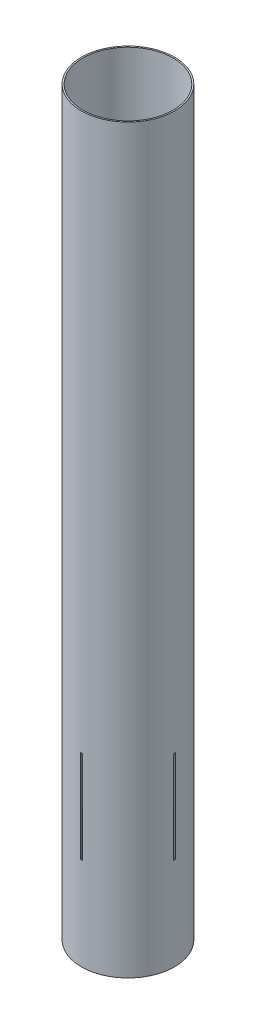
ISO-10303-21;
HEADER;
FILE_DESCRIPTION(('STEP AP214'),'2;1');
FILE_NAME('part.step','',(''),(''),'','','');
FILE_SCHEMA(('AUTOMOTIVE_DESIGN { 1 0 10303 214 1 1 1 1 }'));
ENDSEC;
DATA;
#1=APPLICATION_CONTEXT('core data for automotive mechanical design processes');
#2=APPLICATION_PROTOCOL_DEFINITION('international standard','automotive_design',2000,#1);
#3=PRODUCT_CONTEXT('',#1,'mechanical');
#4=PRODUCT('Part','Part','',(#3));
#5=PRODUCT_RELATED_PRODUCT_CATEGORY('part','',(#4));
#6=PRODUCT_DEFINITION_FORMATION('','',#4);
#7=PRODUCT_DEFINITION_CONTEXT('part definition',#1,'design');
#8=PRODUCT_DEFINITION('design','',#6,#7);
#9=PRODUCT_DEFINITION_SHAPE('','',#8);
#10=(LENGTH_UNIT() NAMED_UNIT(*) SI_UNIT(.MILLI.,.METRE.));
#11=(NAMED_UNIT(*) PLANE_ANGLE_UNIT() SI_UNIT($,.RADIAN.));
#12=(NAMED_UNIT(*) SI_UNIT($,.STERADIAN.) SOLID_ANGLE_UNIT());
#13=UNCERTAINTY_MEASURE_WITH_UNIT(LENGTH_MEASURE(1.E-05),#10,'distance_accuracy_value','');
#14=(GEOMETRIC_REPRESENTATION_CONTEXT(3) GLOBAL_UNCERTAINTY_ASSIGNED_CONTEXT((#13)) GLOBAL_UNIT_ASSIGNED_CONTEXT((#10,
#11,#12)) REPRESENTATION_CONTEXT('',''));
#15=CARTESIAN_POINT('',(0.,0.,0.));
#16=DIRECTION('',(0.,0.,1.));
#17=DIRECTION('',(1.,0.,0.));
#18=AXIS2_PLACEMENT_3D('',#15,#16,#17);
#19=CARTESIAN_POINT('',(0.,812.8,0.));
#20=DIRECTION('',(0.,-1.,0.));
#21=DIRECTION('',(0.,0.,-1.));
#22=AXIS2_PLACEMENT_3D('',#19,#20,#21);
#23=CYLINDRICAL_SURFACE('',#22,51.1048);
#24=CARTESIAN_POINT('',(0.,203.2,0.));
#25=DIRECTION('',(0.,-1.,0.));
#26=DIRECTION('',(0.,0.,-1.));
#27=AXIS2_PLACEMENT_3D('',#24,#25,#26);
#28=CIRCLE('',#27,51.1048);
#29=CARTESIAN_POINT('',(-51.0919024440625,203.2,1.14808));
#30=VERTEX_POINT('',#29);
#31=CARTESIAN_POINT('',(-51.0919024440625,203.2,-1.14808));
#32=VERTEX_POINT('',#31);
#33=EDGE_CURVE('E286',#30,#32,#28,.T.);
#34=ORIENTED_EDGE('',*,*,#33,.F.);
#35=DIRECTION('',(0.,-1.,0.));
#36=VECTOR('',#35,1.);
#37=CARTESIAN_POINT('',(-51.0919024440625,812.8,1.14808));
#38=LINE('',#37,#36);
#39=CARTESIAN_POINT('',(-51.0919024440625,101.6,1.14808));
#40=VERTEX_POINT('',#39);
#41=EDGE_CURVE('E291',#30,#40,#38,.T.);
#42=ORIENTED_EDGE('',*,*,#41,.T.);
#43=CARTESIAN_POINT('',(0.,101.6,0.));
#44=DIRECTION('',(0.,-1.,0.));
#45=DIRECTION('',(0.,0.,-1.));
#46=AXIS2_PLACEMENT_3D('',#43,#44,#45);
#47=CIRCLE('',#46,51.1048);
#48=CARTESIAN_POINT('',(-51.0919024440625,101.6,-1.14808));
#49=VERTEX_POINT('',#48);
#50=EDGE_CURVE('E283',#40,#49,#47,.T.);
#51=ORIENTED_EDGE('',*,*,#50,.T.);
#52=DIRECTION('',(0.,-1.,0.));
#53=VECTOR('',#52,1.);
#54=CARTESIAN_POINT('',(-51.0919024440625,812.8,-1.14808));
#55=LINE('',#54,#53);
#56=EDGE_CURVE('E288',#49,#32,#55,.F.);
#57=ORIENTED_EDGE('',*,*,#56,.T.);
#58=EDGE_LOOP('',(#34,#42,#51,#57));
#59=FACE_BOUND('',#58,.T.);
#60=CARTESIAN_POINT('',(0.,203.2,0.));
#61=DIRECTION('',(0.,-1.,0.));
#62=DIRECTION('',(0.,0.,-1.));
#63=AXIS2_PLACEMENT_3D('',#60,#61,#62);
#64=CIRCLE('',#63,51.1048);
#65=CARTESIAN_POINT('',(51.0919024440625,203.2,-1.14807999999999));
#66=VERTEX_POINT('',#65);
#67=CARTESIAN_POINT('',(51.0919024440625,203.2,1.14808000000001));
#68=VERTEX_POINT('',#67);
#69=EDGE_CURVE('E266',#66,#68,#64,.T.);
#70=ORIENTED_EDGE('',*,*,#69,.F.);
#71=DIRECTION('',(0.,-1.,0.));
#72=VECTOR('',#71,1.);
#73=CARTESIAN_POINT('',(51.0919024440625,812.8,-1.14807999999999));
#74=LINE('',#73,#72);
#75=CARTESIAN_POINT('',(51.0919024440625,101.6,-1.14807999999999));
#76=VERTEX_POINT('',#75);
#77=EDGE_CURVE('E269',#66,#76,#74,.T.);
#78=ORIENTED_EDGE('',*,*,#77,.T.);
#79=CARTESIAN_POINT('',(0.,101.6,0.));
#80=DIRECTION('',(0.,-1.,0.));
#81=DIRECTION('',(0.,0.,-1.));
#82=AXIS2_PLACEMENT_3D('',#79,#80,#81);
#83=CIRCLE('',#82,51.1048);
#84=CARTESIAN_POINT('',(51.0919024440625,101.6,1.14808000000001));
#85=VERTEX_POINT('',#84);
#86=EDGE_CURVE('E264',#76,#85,#83,.T.);
#87=ORIENTED_EDGE('',*,*,#86,.T.);
#88=DIRECTION('',(0.,-1.,0.));
#89=VECTOR('',#88,1.);
#90=CARTESIAN_POINT('',(51.0919024440625,812.8,1.14808000000001));
#91=LINE('',#90,#89);
#92=EDGE_CURVE('E173',#85,#68,#91,.F.);
#93=ORIENTED_EDGE('',*,*,#92,.T.);
#94=EDGE_LOOP('',(#70,#78,#87,#93));
#95=FACE_BOUND('',#94,.T.);
#96=CARTESIAN_POINT('',(0.,812.8,0.));
#97=DIRECTION('',(0.,1.,0.));
#98=DIRECTION('',(0.,0.,1.));
#99=AXIS2_PLACEMENT_3D('',#96,#97,#98);
#100=CIRCLE('',#99,51.1048);
#101=CARTESIAN_POINT('',(0.,812.8,51.1048));
#102=VERTEX_POINT('',#101);
#103=EDGE_CURVE('E166',#102,#102,#100,.T.);
#104=ORIENTED_EDGE('',*,*,#103,.F.);
#105=EDGE_LOOP('',(#104));
#106=FACE_BOUND('',#105,.T.);
#107=CARTESIAN_POINT('',(0.,0.,0.));
#108=DIRECTION('',(0.,1.,0.));
#109=DIRECTION('',(0.,0.,1.));
#110=AXIS2_PLACEMENT_3D('',#107,#108,#109);
#111=CIRCLE('',#110,51.1048);
#112=CARTESIAN_POINT('',(0.,0.,51.1048));
#113=VERTEX_POINT('',#112);
#114=EDGE_CURVE('E305',#113,#113,#111,.T.);
#115=ORIENTED_EDGE('',*,*,#114,.T.);
#116=EDGE_LOOP('',(#115));
#117=FACE_BOUND('',#116,.T.);
#118=CARTESIAN_POINT('',(0.,203.2,0.));
#119=DIRECTION('',(0.,-1.,0.));
#120=DIRECTION('',(0.,0.,-1.));
#121=AXIS2_PLACEMENT_3D('',#118,#119,#120);
#122=CIRCLE('',#121,51.1048);
#123=CARTESIAN_POINT('',(1.14807999999999,203.2,51.0919024440625));
#124=VERTEX_POINT('',#123);
#125=CARTESIAN_POINT('',(-1.14808000000001,203.2,51.0919024440625));
#126=VERTEX_POINT('',#125);
#127=EDGE_CURVE('E275',#124,#126,#122,.T.);
#128=ORIENTED_EDGE('',*,*,#127,.F.);
#129=DIRECTION('',(0.,-1.,0.));
#130=VECTOR('',#129,1.);
#131=CARTESIAN_POINT('',(1.14807999999999,812.8,51.0919024440625));
#132=LINE('',#131,#130);
#133=CARTESIAN_POINT('',(1.14807999999999,101.6,51.0919024440625));
#134=VERTEX_POINT('',#133);
#135=EDGE_CURVE('E280',#124,#134,#132,.T.);
#136=ORIENTED_EDGE('',*,*,#135,.T.);
#137=CARTESIAN_POINT('',(0.,101.6,0.));
#138=DIRECTION('',(0.,-1.,0.));
#139=DIRECTION('',(0.,0.,-1.));
#140=AXIS2_PLACEMENT_3D('',#137,#138,#139);
#141=CIRCLE('',#140,51.1048);
#142=CARTESIAN_POINT('',(-1.14808000000001,101.6,51.0919024440625));
#143=VERTEX_POINT('',#142);
#144=EDGE_CURVE('E272',#134,#143,#141,.T.);
#145=ORIENTED_EDGE('',*,*,#144,.T.);
#146=DIRECTION('',(0.,-1.,0.));
#147=VECTOR('',#146,1.);
#148=CARTESIAN_POINT('',(-1.14808000000001,812.8,51.0919024440625));
#149=LINE('',#148,#147);
#150=EDGE_CURVE('E277',#143,#126,#149,.F.);
#151=ORIENTED_EDGE('',*,*,#150,.T.);
#152=EDGE_LOOP('',(#128,#136,#145,#151));
#153=FACE_BOUND('',#152,.T.);
#154=CARTESIAN_POINT('',(0.,203.2,0.));
#155=DIRECTION('',(0.,-1.,0.));
#156=DIRECTION('',(0.,0.,-1.));
#157=AXIS2_PLACEMENT_3D('',#154,#155,#156);
#158=CIRCLE('',#157,51.1048);
#159=CARTESIAN_POINT('',(-1.14808,203.2,-51.0919024440625));
#160=VERTEX_POINT('',#159);
#161=CARTESIAN_POINT('',(1.14808,203.2,-51.0919024440625));
#162=VERTEX_POINT('',#161);
#163=EDGE_CURVE('E296',#160,#162,#158,.T.);
#164=ORIENTED_EDGE('',*,*,#163,.F.);
#165=DIRECTION('',(0.,-1.,0.));
#166=VECTOR('',#165,1.);
#167=CARTESIAN_POINT('',(-1.14808,812.8,-51.0919024440625));
#168=LINE('',#167,#166);
#169=CARTESIAN_POINT('',(-1.14808,101.6,-51.0919024440625));
#170=VERTEX_POINT('',#169);
#171=EDGE_CURVE('E299',#160,#170,#168,.T.);
#172=ORIENTED_EDGE('',*,*,#171,.T.);
#173=CARTESIAN_POINT('',(0.,101.6,0.));
#174=DIRECTION('',(0.,-1.,0.));
#175=DIRECTION('',(0.,0.,-1.));
#176=AXIS2_PLACEMENT_3D('',#173,#174,#175);
#177=CIRCLE('',#176,51.1048);
#178=CARTESIAN_POINT('',(1.14808,101.6,-51.0919024440625));
#179=VERTEX_POINT('',#178);
#180=EDGE_CURVE('E294',#170,#179,#177,.T.);
#181=ORIENTED_EDGE('',*,*,#180,.T.);
#182=DIRECTION('',(0.,-1.,0.));
#183=VECTOR('',#182,1.);
#184=CARTESIAN_POINT('',(1.14808,812.8,-51.0919024440625));
#185=LINE('',#184,#183);
#186=EDGE_CURVE('E229',#179,#162,#185,.F.);
#187=ORIENTED_EDGE('',*,*,#186,.T.);
#188=EDGE_LOOP('',(#164,#172,#181,#187));
#189=FACE_BOUND('',#188,.T.);
#190=ADVANCED_FACE('F43',(#59,#95,#106,#117,#153,#189),#23,.T.);
#191=CARTESIAN_POINT('',(0.,812.8,0.));
#192=DIRECTION('',(0.,-1.,0.));
#193=DIRECTION('',(0.,0.,-1.));
#194=AXIS2_PLACEMENT_3D('',#191,#192,#193);
#195=CYLINDRICAL_SURFACE('',#194,49.53);
#196=CARTESIAN_POINT('',(0.,812.8,0.));
#197=DIRECTION('',(0.,1.,0.));
#198=DIRECTION('',(0.,0.,1.));
#199=AXIS2_PLACEMENT_3D('',#196,#197,#198);
#200=CIRCLE('',#199,49.53);
#201=CARTESIAN_POINT('',(0.,812.8,49.53));
#202=VERTEX_POINT('',#201);
#203=EDGE_CURVE('E302',#202,#202,#200,.T.);
#204=ORIENTED_EDGE('',*,*,#203,.T.);
#205=EDGE_LOOP('',(#204));
#206=FACE_BOUND('',#205,.T.);
#207=CARTESIAN_POINT('',(0.,0.,0.));
#208=DIRECTION('',(0.,1.,0.));
#209=DIRECTION('',(0.,0.,1.));
#210=AXIS2_PLACEMENT_3D('',#207,#208,#209);
#211=CIRCLE('',#210,49.53);
#212=CARTESIAN_POINT('',(0.,0.,49.53));
#213=VERTEX_POINT('',#212);
#214=EDGE_CURVE('E301',#213,#213,#211,.T.);
#215=ORIENTED_EDGE('',*,*,#214,.F.);
#216=EDGE_LOOP('',(#215));
#217=FACE_BOUND('',#216,.T.);
#218=DIRECTION('',(0.,-1.,0.));
#219=VECTOR('',#218,1.);
#220=CARTESIAN_POINT('',(49.5166922594149,812.8,-1.14807999999999));
#221=LINE('',#220,#219);
#222=CARTESIAN_POINT('',(49.5166922594149,203.2,-1.14807999999999));
#223=VERTEX_POINT('',#222);
#224=CARTESIAN_POINT('',(49.5166922594149,101.6,-1.14807999999999));
#225=VERTEX_POINT('',#224);
#226=EDGE_CURVE('E181',#223,#225,#221,.T.);
#227=ORIENTED_EDGE('',*,*,#226,.F.);
#228=CARTESIAN_POINT('',(0.,203.2,0.));
#229=DIRECTION('',(0.,-1.,0.));
#230=DIRECTION('',(0.,0.,-1.));
#231=AXIS2_PLACEMENT_3D('',#228,#229,#230);
#232=CIRCLE('',#231,49.53);
#233=CARTESIAN_POINT('',(49.5166922594149,203.2,1.14808000000001));
#234=VERTEX_POINT('',#233);
#235=EDGE_CURVE('E180',#223,#234,#232,.T.);
#236=ORIENTED_EDGE('',*,*,#235,.T.);
#237=DIRECTION('',(0.,-1.,0.));
#238=VECTOR('',#237,1.);
#239=CARTESIAN_POINT('',(49.5166922594149,812.8,1.14808000000001));
#240=LINE('',#239,#238);
#241=CARTESIAN_POINT('',(49.5166922594149,101.6,1.14808000000001));
#242=VERTEX_POINT('',#241);
#243=EDGE_CURVE('E165',#242,#234,#240,.F.);
#244=ORIENTED_EDGE('',*,*,#243,.F.);
#245=CARTESIAN_POINT('',(0.,101.6,0.));
#246=DIRECTION('',(0.,-1.,0.));
#247=DIRECTION('',(0.,0.,-1.));
#248=AXIS2_PLACEMENT_3D('',#245,#246,#247);
#249=CIRCLE('',#248,49.53);
#250=EDGE_CURVE('E154',#225,#242,#249,.T.);
#251=ORIENTED_EDGE('',*,*,#250,.F.);
#252=EDGE_LOOP('',(#227,#236,#244,#251));
#253=FACE_BOUND('',#252,.T.);
#254=DIRECTION('',(0.,-1.,0.));
#255=VECTOR('',#254,1.);
#256=CARTESIAN_POINT('',(1.14807999999999,812.8,49.5166922594149));
#257=LINE('',#256,#255);
#258=CARTESIAN_POINT('',(1.14807999999999,203.2,49.5166922594149));
#259=VERTEX_POINT('',#258);
#260=CARTESIAN_POINT('',(1.14807999999999,101.6,49.5166922594149));
#261=VERTEX_POINT('',#260);
#262=EDGE_CURVE('E191',#259,#261,#257,.T.);
#263=ORIENTED_EDGE('',*,*,#262,.F.);
#264=CARTESIAN_POINT('',(0.,203.2,0.));
#265=DIRECTION('',(0.,-1.,0.));
#266=DIRECTION('',(0.,0.,-1.));
#267=AXIS2_PLACEMENT_3D('',#264,#265,#266);
#268=CIRCLE('',#267,49.53);
#269=CARTESIAN_POINT('',(-1.14808000000001,203.2,49.5166922594149));
#270=VERTEX_POINT('',#269);
#271=EDGE_CURVE('E194',#259,#270,#268,.T.);
#272=ORIENTED_EDGE('',*,*,#271,.T.);
#273=DIRECTION('',(0.,-1.,0.));
#274=VECTOR('',#273,1.);
#275=CARTESIAN_POINT('',(-1.14808000000001,812.8,49.5166922594149));
#276=LINE('',#275,#274);
#277=CARTESIAN_POINT('',(-1.14808000000001,101.6,49.5166922594149));
#278=VERTEX_POINT('',#277);
#279=EDGE_CURVE('E189',#278,#270,#276,.F.);
#280=ORIENTED_EDGE('',*,*,#279,.F.);
#281=CARTESIAN_POINT('',(0.,101.6,0.));
#282=DIRECTION('',(0.,-1.,0.));
#283=DIRECTION('',(0.,0.,-1.));
#284=AXIS2_PLACEMENT_3D('',#281,#282,#283);
#285=CIRCLE('',#284,49.53);
#286=EDGE_CURVE('E187',#261,#278,#285,.T.);
#287=ORIENTED_EDGE('',*,*,#286,.F.);
#288=EDGE_LOOP('',(#263,#272,#280,#287));
#289=FACE_BOUND('',#288,.T.);
#290=DIRECTION('',(0.,-1.,0.));
#291=VECTOR('',#290,1.);
#292=CARTESIAN_POINT('',(-49.5166922594149,812.8,1.14808));
#293=LINE('',#292,#291);
#294=CARTESIAN_POINT('',(-49.5166922594149,203.2,1.14808));
#295=VERTEX_POINT('',#294);
#296=CARTESIAN_POINT('',(-49.5166922594149,101.6,1.14808));
#297=VERTEX_POINT('',#296);
#298=EDGE_CURVE('E201',#295,#297,#293,.T.);
#299=ORIENTED_EDGE('',*,*,#298,.F.);
#300=CARTESIAN_POINT('',(0.,203.2,0.));
#301=DIRECTION('',(0.,-1.,0.));
#302=DIRECTION('',(0.,0.,-1.));
#303=AXIS2_PLACEMENT_3D('',#300,#301,#302);
#304=CIRCLE('',#303,49.53);
#305=CARTESIAN_POINT('',(-49.5166922594149,203.2,-1.14808));
#306=VERTEX_POINT('',#305);
#307=EDGE_CURVE('E204',#295,#306,#304,.T.);
#308=ORIENTED_EDGE('',*,*,#307,.T.);
#309=DIRECTION('',(0.,-1.,0.));
#310=VECTOR('',#309,1.);
#311=CARTESIAN_POINT('',(-49.5166922594149,812.8,-1.14808));
#312=LINE('',#311,#310);
#313=CARTESIAN_POINT('',(-49.5166922594149,101.6,-1.14808));
#314=VERTEX_POINT('',#313);
#315=EDGE_CURVE('E199',#314,#306,#312,.F.);
#316=ORIENTED_EDGE('',*,*,#315,.F.);
#317=CARTESIAN_POINT('',(0.,101.6,0.));
#318=DIRECTION('',(0.,-1.,0.));
#319=DIRECTION('',(0.,0.,-1.));
#320=AXIS2_PLACEMENT_3D('',#317,#318,#319);
#321=CIRCLE('',#320,49.53);
#322=EDGE_CURVE('E197',#297,#314,#321,.T.);
#323=ORIENTED_EDGE('',*,*,#322,.F.);
#324=EDGE_LOOP('',(#299,#308,#316,#323));
#325=FACE_BOUND('',#324,.T.);
#326=DIRECTION('',(0.,-1.,0.));
#327=VECTOR('',#326,1.);
#328=CARTESIAN_POINT('',(-1.14808,812.8,-49.5166922594149));
#329=LINE('',#328,#327);
#330=CARTESIAN_POINT('',(-1.14808,203.2,-49.5166922594149));
#331=VERTEX_POINT('',#330);
#332=CARTESIAN_POINT('',(-1.14808,101.6,-49.5166922594149));
#333=VERTEX_POINT('',#332);
#334=EDGE_CURVE('E50',#331,#333,#329,.T.);
#335=ORIENTED_EDGE('',*,*,#334,.F.);
#336=CARTESIAN_POINT('',(0.,203.2,0.));
#337=DIRECTION('',(0.,-1.,0.));
#338=DIRECTION('',(0.,0.,-1.));
#339=AXIS2_PLACEMENT_3D('',#336,#337,#338);
#340=CIRCLE('',#339,49.53);
#341=CARTESIAN_POINT('',(1.14808,203.2,-49.5166922594149));
#342=VERTEX_POINT('',#341);
#343=EDGE_CURVE('E11',#331,#342,#340,.T.);
#344=ORIENTED_EDGE('',*,*,#343,.T.);
#345=DIRECTION('',(0.,-1.,0.));
#346=VECTOR('',#345,1.);
#347=CARTESIAN_POINT('',(1.14808,812.8,-49.5166922594149));
#348=LINE('',#347,#346);
#349=CARTESIAN_POINT('',(1.14808,101.6,-49.5166922594149));
#350=VERTEX_POINT('',#349);
#351=EDGE_CURVE('E209',#350,#342,#348,.F.);
#352=ORIENTED_EDGE('',*,*,#351,.F.);
#353=CARTESIAN_POINT('',(0.,101.6,0.));
#354=DIRECTION('',(0.,-1.,0.));
#355=DIRECTION('',(0.,0.,-1.));
#356=AXIS2_PLACEMENT_3D('',#353,#354,#355);
#357=CIRCLE('',#356,49.53);
#358=EDGE_CURVE('E207',#333,#350,#357,.T.);
#359=ORIENTED_EDGE('',*,*,#358,.F.);
#360=EDGE_LOOP('',(#335,#344,#352,#359));
#361=FACE_BOUND('',#360,.T.);
#362=ADVANCED_FACE('F178',(#206,#217,#253,#289,#325,#361),#195,.F.);
#363=CARTESIAN_POINT('',(0.,812.8,0.));
#364=DIRECTION('',(0.,1.,0.));
#365=DIRECTION('',(0.,0.,1.));
#366=AXIS2_PLACEMENT_3D('',#363,#364,#365);
#367=PLANE('',#366);
#368=ORIENTED_EDGE('',*,*,#103,.T.);
#369=EDGE_LOOP('',(#368));
#370=FACE_BOUND('',#369,.T.);
#371=ORIENTED_EDGE('',*,*,#203,.F.);
#372=EDGE_LOOP('',(#371));
#373=FACE_BOUND('',#372,.T.);
#374=ADVANCED_FACE('F318',(#370,#373),#367,.T.);
#375=CARTESIAN_POINT('',(0.,0.,0.));
#376=DIRECTION('',(0.,1.,0.));
#377=DIRECTION('',(0.,0.,1.));
#378=AXIS2_PLACEMENT_3D('',#375,#376,#377);
#379=PLANE('',#378);
#380=ORIENTED_EDGE('',*,*,#114,.F.);
#381=EDGE_LOOP('',(#380));
#382=FACE_BOUND('',#381,.T.);
#383=ORIENTED_EDGE('',*,*,#214,.T.);
#384=EDGE_LOOP('',(#383));
#385=FACE_BOUND('',#384,.T.);
#386=ADVANCED_FACE('F314',(#382,#385),#379,.F.);
#387=CARTESIAN_POINT('',(51.7271570187008,203.2,-1.14807999999999));
#388=DIRECTION('',(0.,0.,-1.));
#389=DIRECTION('',(-1.,0.,0.));
#390=AXIS2_PLACEMENT_3D('',#387,#388,#389);
#391=PLANE('',#390);
#392=DIRECTION('',(1.,0.,0.));
#393=VECTOR('',#392,1.);
#394=CARTESIAN_POINT('',(51.7271570187008,203.2,-1.14807999999999));
#395=LINE('',#394,#393);
#396=EDGE_CURVE('E260',#223,#66,#395,.T.);
#397=ORIENTED_EDGE('',*,*,#396,.F.);
#398=ORIENTED_EDGE('',*,*,#226,.T.);
#399=DIRECTION('',(1.,0.,0.));
#400=VECTOR('',#399,1.);
#401=CARTESIAN_POINT('',(51.7271570187008,101.6,-1.14807999999999));
#402=LINE('',#401,#400);
#403=EDGE_CURVE('E160',#225,#76,#402,.T.);
#404=ORIENTED_EDGE('',*,*,#403,.T.);
#405=ORIENTED_EDGE('',*,*,#77,.F.);
#406=EDGE_LOOP('',(#397,#398,#404,#405));
#407=FACE_BOUND('',#406,.T.);
#408=ADVANCED_FACE('F317',(#407),#391,.F.);
#409=CARTESIAN_POINT('',(51.7271570187008,203.2,1.14808000000001));
#410=DIRECTION('',(0.,0.,1.));
#411=DIRECTION('',(1.,0.,0.));
#412=AXIS2_PLACEMENT_3D('',#409,#410,#411);
#413=PLANE('',#412);
#414=DIRECTION('',(-1.,0.,0.));
#415=VECTOR('',#414,1.);
#416=CARTESIAN_POINT('',(51.7271570187008,101.6,1.14808000000001));
#417=LINE('',#416,#415);
#418=EDGE_CURVE('E157',#85,#242,#417,.T.);
#419=ORIENTED_EDGE('',*,*,#418,.T.);
#420=ORIENTED_EDGE('',*,*,#243,.T.);
#421=DIRECTION('',(-1.,0.,0.));
#422=VECTOR('',#421,1.);
#423=CARTESIAN_POINT('',(51.7271570187008,203.2,1.14808000000001));
#424=LINE('',#423,#422);
#425=EDGE_CURVE('E258',#68,#234,#424,.T.);
#426=ORIENTED_EDGE('',*,*,#425,.F.);
#427=ORIENTED_EDGE('',*,*,#92,.F.);
#428=EDGE_LOOP('',(#419,#420,#426,#427));
#429=FACE_BOUND('',#428,.T.);
#430=ADVANCED_FACE('F169',(#429),#413,.F.);
#431=CARTESIAN_POINT('',(0.,203.2,0.));
#432=DIRECTION('',(0.,-1.,0.));
#433=DIRECTION('',(0.,0.,-1.));
#434=AXIS2_PLACEMENT_3D('',#431,#432,#433);
#435=PLANE('',#434);
#436=ORIENTED_EDGE('',*,*,#69,.T.);
#437=ORIENTED_EDGE('',*,*,#425,.T.);
#438=ORIENTED_EDGE('',*,*,#235,.F.);
#439=ORIENTED_EDGE('',*,*,#396,.T.);
#440=EDGE_LOOP('',(#436,#437,#438,#439));
#441=FACE_BOUND('',#440,.T.);
#442=ADVANCED_FACE('F333',(#441),#435,.T.);
#443=CARTESIAN_POINT('',(0.,101.6,0.));
#444=DIRECTION('',(0.,-1.,0.));
#445=DIRECTION('',(0.,0.,-1.));
#446=AXIS2_PLACEMENT_3D('',#443,#444,#445);
#447=PLANE('',#446);
#448=ORIENTED_EDGE('',*,*,#403,.F.);
#449=ORIENTED_EDGE('',*,*,#250,.T.);
#450=ORIENTED_EDGE('',*,*,#418,.F.);
#451=ORIENTED_EDGE('',*,*,#86,.F.);
#452=EDGE_LOOP('',(#448,#449,#450,#451));
#453=FACE_BOUND('',#452,.T.);
#454=ADVANCED_FACE('F156',(#453),#447,.F.);
#455=CARTESIAN_POINT('',(1.14807999999999,203.2,51.7271570187008));
#456=DIRECTION('',(1.,0.,0.));
#457=DIRECTION('',(0.,0.,-1.));
#458=AXIS2_PLACEMENT_3D('',#455,#456,#457);
#459=PLANE('',#458);
#460=DIRECTION('',(0.,0.,1.));
#461=VECTOR('',#460,1.);
#462=CARTESIAN_POINT('',(1.14807999999999,203.2,51.7271570187008));
#463=LINE('',#462,#461);
#464=EDGE_CURVE('E175',#259,#124,#463,.T.);
#465=ORIENTED_EDGE('',*,*,#464,.F.);
#466=ORIENTED_EDGE('',*,*,#262,.T.);
#467=DIRECTION('',(0.,0.,1.));
#468=VECTOR('',#467,1.);
#469=CARTESIAN_POINT('',(1.14807999999999,101.6,51.7271570187008));
#470=LINE('',#469,#468);
#471=EDGE_CURVE('E248',#261,#134,#470,.T.);
#472=ORIENTED_EDGE('',*,*,#471,.T.);
#473=ORIENTED_EDGE('',*,*,#135,.F.);
#474=EDGE_LOOP('',(#465,#466,#472,#473));
#475=FACE_BOUND('',#474,.T.);
#476=ADVANCED_FACE('F339',(#475),#459,.F.);
#477=CARTESIAN_POINT('',(-1.14808000000001,203.2,51.7271570187008));
#478=DIRECTION('',(-1.,0.,0.));
#479=DIRECTION('',(0.,0.,1.));
#480=AXIS2_PLACEMENT_3D('',#477,#478,#479);
#481=PLANE('',#480);
#482=DIRECTION('',(0.,0.,-1.));
#483=VECTOR('',#482,1.);
#484=CARTESIAN_POINT('',(-1.14808000000001,101.6,51.7271570187008));
#485=LINE('',#484,#483);
#486=EDGE_CURVE('E245',#143,#278,#485,.T.);
#487=ORIENTED_EDGE('',*,*,#486,.T.);
#488=ORIENTED_EDGE('',*,*,#279,.T.);
#489=DIRECTION('',(0.,0.,-1.));
#490=VECTOR('',#489,1.);
#491=CARTESIAN_POINT('',(-1.14808000000001,203.2,51.7271570187008));
#492=LINE('',#491,#490);
#493=EDGE_CURVE('E251',#126,#270,#492,.T.);
#494=ORIENTED_EDGE('',*,*,#493,.F.);
#495=ORIENTED_EDGE('',*,*,#150,.F.);
#496=EDGE_LOOP('',(#487,#488,#494,#495));
#497=FACE_BOUND('',#496,.T.);
#498=ADVANCED_FACE('F348',(#497),#481,.F.);
#499=CARTESIAN_POINT('',(0.,203.2,0.));
#500=DIRECTION('',(0.,-1.,0.));
#501=DIRECTION('',(0.,0.,-1.));
#502=AXIS2_PLACEMENT_3D('',#499,#500,#501);
#503=PLANE('',#502);
#504=ORIENTED_EDGE('',*,*,#127,.T.);
#505=ORIENTED_EDGE('',*,*,#493,.T.);
#506=ORIENTED_EDGE('',*,*,#271,.F.);
#507=ORIENTED_EDGE('',*,*,#464,.T.);
#508=EDGE_LOOP('',(#504,#505,#506,#507));
#509=FACE_BOUND('',#508,.T.);
#510=ADVANCED_FACE('F344',(#509),#503,.T.);
#511=CARTESIAN_POINT('',(0.,101.6,0.));
#512=DIRECTION('',(0.,-1.,0.));
#513=DIRECTION('',(0.,0.,-1.));
#514=AXIS2_PLACEMENT_3D('',#511,#512,#513);
#515=PLANE('',#514);
#516=ORIENTED_EDGE('',*,*,#471,.F.);
#517=ORIENTED_EDGE('',*,*,#286,.T.);
#518=ORIENTED_EDGE('',*,*,#486,.F.);
#519=ORIENTED_EDGE('',*,*,#144,.F.);
#520=EDGE_LOOP('',(#516,#517,#518,#519));
#521=FACE_BOUND('',#520,.T.);
#522=ADVANCED_FACE('F347',(#521),#515,.F.);
#523=CARTESIAN_POINT('',(-51.7271570187008,203.2,1.14808));
#524=DIRECTION('',(0.,0.,1.));
#525=DIRECTION('',(1.,0.,0.));
#526=AXIS2_PLACEMENT_3D('',#523,#524,#525);
#527=PLANE('',#526);
#528=DIRECTION('',(-1.,0.,0.));
#529=VECTOR('',#528,1.);
#530=CARTESIAN_POINT('',(-51.7271570187008,203.2,1.14808));
#531=LINE('',#530,#529);
#532=EDGE_CURVE('E242',#295,#30,#531,.T.);
#533=ORIENTED_EDGE('',*,*,#532,.F.);
#534=ORIENTED_EDGE('',*,*,#298,.T.);
#535=DIRECTION('',(-1.,0.,0.));
#536=VECTOR('',#535,1.);
#537=CARTESIAN_POINT('',(-51.7271570187008,101.6,1.14808));
#538=LINE('',#537,#536);
#539=EDGE_CURVE('E234',#297,#40,#538,.T.);
#540=ORIENTED_EDGE('',*,*,#539,.T.);
#541=ORIENTED_EDGE('',*,*,#41,.F.);
#542=EDGE_LOOP('',(#533,#534,#540,#541));
#543=FACE_BOUND('',#542,.T.);
#544=ADVANCED_FACE('F352',(#543),#527,.F.);
#545=CARTESIAN_POINT('',(-51.7271570187008,203.2,-1.14808));
#546=DIRECTION('',(0.,0.,-1.));
#547=DIRECTION('',(-1.,0.,0.));
#548=AXIS2_PLACEMENT_3D('',#545,#546,#547);
#549=PLANE('',#548);
#550=DIRECTION('',(1.,0.,0.));
#551=VECTOR('',#550,1.);
#552=CARTESIAN_POINT('',(-51.7271570187008,101.6,-1.14808));
#553=LINE('',#552,#551);
#554=EDGE_CURVE('E65',#49,#314,#553,.T.);
#555=ORIENTED_EDGE('',*,*,#554,.T.);
#556=ORIENTED_EDGE('',*,*,#315,.T.);
#557=DIRECTION('',(1.,0.,0.));
#558=VECTOR('',#557,1.);
#559=CARTESIAN_POINT('',(-51.7271570187008,203.2,-1.14808));
#560=LINE('',#559,#558);
#561=EDGE_CURVE('E240',#32,#306,#560,.T.);
#562=ORIENTED_EDGE('',*,*,#561,.F.);
#563=ORIENTED_EDGE('',*,*,#56,.F.);
#564=EDGE_LOOP('',(#555,#556,#562,#563));
#565=FACE_BOUND('',#564,.T.);
#566=ADVANCED_FACE('F364',(#565),#549,.F.);
#567=CARTESIAN_POINT('',(0.,203.2,0.));
#568=DIRECTION('',(0.,-1.,0.));
#569=DIRECTION('',(0.,0.,-1.));
#570=AXIS2_PLACEMENT_3D('',#567,#568,#569);
#571=PLANE('',#570);
#572=ORIENTED_EDGE('',*,*,#33,.T.);
#573=ORIENTED_EDGE('',*,*,#561,.T.);
#574=ORIENTED_EDGE('',*,*,#307,.F.);
#575=ORIENTED_EDGE('',*,*,#532,.T.);
#576=EDGE_LOOP('',(#572,#573,#574,#575));
#577=FACE_BOUND('',#576,.T.);
#578=ADVANCED_FACE('F360',(#577),#571,.T.);
#579=CARTESIAN_POINT('',(0.,101.6,0.));
#580=DIRECTION('',(0.,-1.,0.));
#581=DIRECTION('',(0.,0.,-1.));
#582=AXIS2_PLACEMENT_3D('',#579,#580,#581);
#583=PLANE('',#582);
#584=ORIENTED_EDGE('',*,*,#539,.F.);
#585=ORIENTED_EDGE('',*,*,#322,.T.);
#586=ORIENTED_EDGE('',*,*,#554,.F.);
#587=ORIENTED_EDGE('',*,*,#50,.F.);
#588=EDGE_LOOP('',(#584,#585,#586,#587));
#589=FACE_BOUND('',#588,.T.);
#590=ADVANCED_FACE('F363',(#589),#583,.F.);
#591=CARTESIAN_POINT('',(-1.14808,203.2,-51.7271570187008));
#592=DIRECTION('',(-1.,0.,0.));
#593=DIRECTION('',(0.,0.,1.));
#594=AXIS2_PLACEMENT_3D('',#591,#592,#593);
#595=PLANE('',#594);
#596=DIRECTION('',(0.,0.,-1.));
#597=VECTOR('',#596,1.);
#598=CARTESIAN_POINT('',(-1.14808,203.2,-51.7271570187008));
#599=LINE('',#598,#597);
#600=EDGE_CURVE('E220',#331,#160,#599,.T.);
#601=ORIENTED_EDGE('',*,*,#600,.F.);
#602=ORIENTED_EDGE('',*,*,#334,.T.);
#603=DIRECTION('',(0.,0.,-1.));
#604=VECTOR('',#603,1.);
#605=CARTESIAN_POINT('',(-1.14808,101.6,-51.7271570187008));
#606=LINE('',#605,#604);
#607=EDGE_CURVE('E217',#333,#170,#606,.T.);
#608=ORIENTED_EDGE('',*,*,#607,.T.);
#609=ORIENTED_EDGE('',*,*,#171,.F.);
#610=EDGE_LOOP('',(#601,#602,#608,#609));
#611=FACE_BOUND('',#610,.T.);
#612=ADVANCED_FACE('F216',(#611),#595,.F.);
#613=CARTESIAN_POINT('',(1.14808,203.2,-51.7271570187008));
#614=DIRECTION('',(1.,0.,0.));
#615=DIRECTION('',(0.,0.,-1.));
#616=AXIS2_PLACEMENT_3D('',#613,#614,#615);
#617=PLANE('',#616);
#618=DIRECTION('',(0.,0.,1.));
#619=VECTOR('',#618,1.);
#620=CARTESIAN_POINT('',(1.14808,101.6,-51.7271570187008));
#621=LINE('',#620,#619);
#622=EDGE_CURVE('E57',#179,#350,#621,.T.);
#623=ORIENTED_EDGE('',*,*,#622,.T.);
#624=ORIENTED_EDGE('',*,*,#351,.T.);
#625=DIRECTION('',(0.,0.,1.));
#626=VECTOR('',#625,1.);
#627=CARTESIAN_POINT('',(1.14808,203.2,-51.7271570187008));
#628=LINE('',#627,#626);
#629=EDGE_CURVE('E232',#162,#342,#628,.T.);
#630=ORIENTED_EDGE('',*,*,#629,.F.);
#631=ORIENTED_EDGE('',*,*,#186,.F.);
#632=EDGE_LOOP('',(#623,#624,#630,#631));
#633=FACE_BOUND('',#632,.T.);
#634=ADVANCED_FACE('F225',(#633),#617,.F.);
#635=CARTESIAN_POINT('',(0.,203.2,0.));
#636=DIRECTION('',(0.,-1.,0.));
#637=DIRECTION('',(0.,0.,-1.));
#638=AXIS2_PLACEMENT_3D('',#635,#636,#637);
#639=PLANE('',#638);
#640=ORIENTED_EDGE('',*,*,#163,.T.);
#641=ORIENTED_EDGE('',*,*,#629,.T.);
#642=ORIENTED_EDGE('',*,*,#343,.F.);
#643=ORIENTED_EDGE('',*,*,#600,.T.);
#644=EDGE_LOOP('',(#640,#641,#642,#643));
#645=FACE_BOUND('',#644,.T.);
#646=ADVANCED_FACE('F376',(#645),#639,.T.);
#647=CARTESIAN_POINT('',(0.,101.6,0.));
#648=DIRECTION('',(0.,-1.,0.));
#649=DIRECTION('',(0.,0.,-1.));
#650=AXIS2_PLACEMENT_3D('',#647,#648,#649);
#651=PLANE('',#650);
#652=ORIENTED_EDGE('',*,*,#607,.F.);
#653=ORIENTED_EDGE('',*,*,#358,.T.);
#654=ORIENTED_EDGE('',*,*,#622,.F.);
#655=ORIENTED_EDGE('',*,*,#180,.F.);
#656=EDGE_LOOP('',(#652,#653,#654,#655));
#657=FACE_BOUND('',#656,.T.);
#658=ADVANCED_FACE('F223',(#657),#651,.F.);
#659=CLOSED_SHELL('',(#190,#362,#374,#386,#408,#430,#442,#454,#476,#498,#510,#522,#544,#566,
#578,#590,#612,#634,#646,#658));
#660=MANIFOLD_SOLID_BREP('B2',#659);
#661=ADVANCED_BREP_SHAPE_REPRESENTATION('',(#18,#660),#14);
#662=SHAPE_DEFINITION_REPRESENTATION(#9,#661);
ENDSEC;
END-ISO-10303-21;
